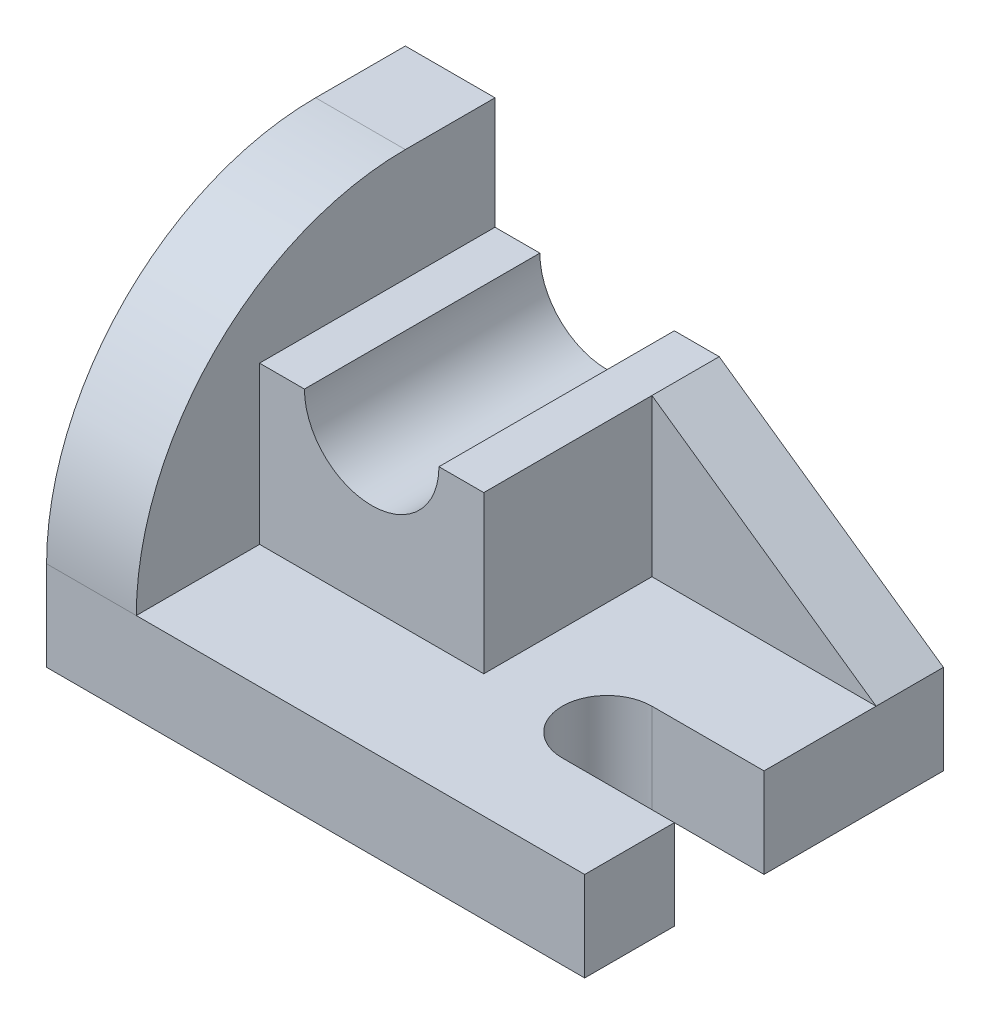
ISO-10303-21;
HEADER;
FILE_DESCRIPTION(('STEP AP214'),'2;1');
FILE_NAME('part.step','',(''),(''),'','','');
FILE_SCHEMA(('AUTOMOTIVE_DESIGN { 1 0 10303 214 1 1 1 1 }'));
ENDSEC;
DATA;
#1=APPLICATION_CONTEXT('core data for automotive mechanical design processes');
#2=APPLICATION_PROTOCOL_DEFINITION('international standard','automotive_design',2000,#1);
#3=PRODUCT_CONTEXT('',#1,'mechanical');
#4=PRODUCT('Part','Part','',(#3));
#5=PRODUCT_RELATED_PRODUCT_CATEGORY('part','',(#4));
#6=PRODUCT_DEFINITION_FORMATION('','',#4);
#7=PRODUCT_DEFINITION_CONTEXT('part definition',#1,'design');
#8=PRODUCT_DEFINITION('design','',#6,#7);
#9=PRODUCT_DEFINITION_SHAPE('','',#8);
#10=(LENGTH_UNIT() NAMED_UNIT(*) SI_UNIT(.MILLI.,.METRE.));
#11=(NAMED_UNIT(*) PLANE_ANGLE_UNIT() SI_UNIT($,.RADIAN.));
#12=(NAMED_UNIT(*) SI_UNIT($,.STERADIAN.) SOLID_ANGLE_UNIT());
#13=UNCERTAINTY_MEASURE_WITH_UNIT(LENGTH_MEASURE(1.E-05),#10,'distance_accuracy_value','');
#14=(GEOMETRIC_REPRESENTATION_CONTEXT(3) GLOBAL_UNCERTAINTY_ASSIGNED_CONTEXT((#13)) GLOBAL_UNIT_ASSIGNED_CONTEXT((#10,
#11,#12)) REPRESENTATION_CONTEXT('',''));
#15=CARTESIAN_POINT('',(0.,0.,0.));
#16=DIRECTION('',(0.,0.,1.));
#17=DIRECTION('',(1.,0.,0.));
#18=AXIS2_PLACEMENT_3D('',#15,#16,#17);
#19=CARTESIAN_POINT('',(60.,0.,64.));
#20=DIRECTION('',(1.,0.,0.));
#21=DIRECTION('',(0.,0.,-1.));
#22=AXIS2_PLACEMENT_3D('',#19,#20,#21);
#23=PLANE('',#22);
#24=DIRECTION('',(0.,1.,0.));
#25=VECTOR('',#24,1.);
#26=CARTESIAN_POINT('',(60.,-16.,32.));
#27=LINE('',#26,#25);
#28=CARTESIAN_POINT('',(60.,-16.,32.));
#29=VERTEX_POINT('',#28);
#30=CARTESIAN_POINT('',(60.,0.,32.));
#31=VERTEX_POINT('',#30);
#32=EDGE_CURVE('E192',#29,#31,#27,.T.);
#33=ORIENTED_EDGE('',*,*,#32,.F.);
#34=DIRECTION('',(0.,0.,-1.));
#35=VECTOR('',#34,1.);
#36=CARTESIAN_POINT('',(60.,-16.,64.));
#37=LINE('',#36,#35);
#38=CARTESIAN_POINT('',(60.,-16.,0.));
#39=VERTEX_POINT('',#38);
#40=EDGE_CURVE('E286',#29,#39,#37,.T.);
#41=ORIENTED_EDGE('',*,*,#40,.T.);
#42=DIRECTION('',(0.,-1.,0.));
#43=VECTOR('',#42,1.);
#44=CARTESIAN_POINT('',(60.,0.,0.));
#45=LINE('',#44,#43);
#46=CARTESIAN_POINT('',(60.,0.,0.));
#47=VERTEX_POINT('',#46);
#48=EDGE_CURVE('E260',#47,#39,#45,.T.);
#49=ORIENTED_EDGE('',*,*,#48,.F.);
#50=DIRECTION('',(0.,0.,-1.));
#51=VECTOR('',#50,1.);
#52=CARTESIAN_POINT('',(60.,0.,12.));
#53=LINE('',#52,#51);
#54=CARTESIAN_POINT('',(60.,0.,12.));
#55=VERTEX_POINT('',#54);
#56=EDGE_CURVE('E250',#55,#47,#53,.T.);
#57=ORIENTED_EDGE('',*,*,#56,.F.);
#58=DIRECTION('',(0.,0.,-1.));
#59=VECTOR('',#58,1.);
#60=CARTESIAN_POINT('',(60.,0.,64.));
#61=LINE('',#60,#59);
#62=EDGE_CURVE('E272',#31,#55,#61,.T.);
#63=ORIENTED_EDGE('',*,*,#62,.F.);
#64=EDGE_LOOP('',(#33,#41,#49,#57,#63));
#65=FACE_BOUND('',#64,.T.);
#66=ADVANCED_FACE('F43',(#65),#23,.T.);
#67=CARTESIAN_POINT('',(0.,28.,42.));
#68=DIRECTION('',(0.,-1.,0.));
#69=DIRECTION('',(1.,0.,0.));
#70=AXIS2_PLACEMENT_3D('',#67,#68,#69);
#71=PLANE('',#70);
#72=DIRECTION('',(-1.,0.,0.));
#73=VECTOR('',#72,1.);
#74=CARTESIAN_POINT('',(0.,28.,0.));
#75=LINE('',#74,#73);
#76=CARTESIAN_POINT('',(20.,28.,0.));
#77=VERTEX_POINT('',#76);
#78=CARTESIAN_POINT('',(12.,28.,0.));
#79=VERTEX_POINT('',#78);
#80=EDGE_CURVE('E293',#77,#79,#75,.T.);
#81=ORIENTED_EDGE('',*,*,#80,.T.);
#82=DIRECTION('',(0.,0.,-1.));
#83=VECTOR('',#82,1.);
#84=CARTESIAN_POINT('',(12.,28.,42.));
#85=LINE('',#84,#83);
#86=CARTESIAN_POINT('',(12.,28.,42.));
#87=VERTEX_POINT('',#86);
#88=EDGE_CURVE('E11',#87,#79,#85,.T.);
#89=ORIENTED_EDGE('',*,*,#88,.F.);
#90=DIRECTION('',(-1.,0.,0.));
#91=VECTOR('',#90,1.);
#92=CARTESIAN_POINT('',(0.,28.,42.));
#93=LINE('',#92,#91);
#94=CARTESIAN_POINT('',(20.,28.,42.));
#95=VERTEX_POINT('',#94);
#96=EDGE_CURVE('E294',#95,#87,#93,.T.);
#97=ORIENTED_EDGE('',*,*,#96,.F.);
#98=DIRECTION('',(0.,0.,-1.));
#99=VECTOR('',#98,1.);
#100=CARTESIAN_POINT('',(20.,28.,42.));
#101=LINE('',#100,#99);
#102=CARTESIAN_POINT('',(20.,28.,12.));
#103=VERTEX_POINT('',#102);
#104=EDGE_CURVE('E316',#95,#103,#101,.T.);
#105=ORIENTED_EDGE('',*,*,#104,.T.);
#106=DIRECTION('',(0.,0.,-1.));
#107=VECTOR('',#106,1.);
#108=CARTESIAN_POINT('',(20.,28.,12.));
#109=LINE('',#108,#107);
#110=EDGE_CURVE('E244',#103,#77,#109,.T.);
#111=ORIENTED_EDGE('',*,*,#110,.T.);
#112=EDGE_LOOP('',(#81,#89,#97,#105,#111));
#113=FACE_BOUND('',#112,.T.);
#114=ADVANCED_FACE('F45',(#113),#71,.F.);
#115=CARTESIAN_POINT('',(0.,28.,42.));
#116=DIRECTION('',(0.,0.,-1.));
#117=DIRECTION('',(-1.,0.,0.));
#118=AXIS2_PLACEMENT_3D('',#115,#116,#117);
#119=CYLINDRICAL_SURFACE('',#118,12.);
#120=CARTESIAN_POINT('',(0.,28.,0.));
#121=DIRECTION('',(0.,0.,1.));
#122=DIRECTION('',(1.,0.,0.));
#123=AXIS2_PLACEMENT_3D('',#120,#121,#122);
#124=CIRCLE('',#123,12.);
#125=CARTESIAN_POINT('',(-12.,28.,0.));
#126=VERTEX_POINT('',#125);
#127=EDGE_CURVE('E320',#79,#126,#124,.F.);
#128=ORIENTED_EDGE('',*,*,#127,.T.);
#129=DIRECTION('',(0.,0.,-1.));
#130=VECTOR('',#129,1.);
#131=CARTESIAN_POINT('',(-12.,28.,42.));
#132=LINE('',#131,#130);
#133=CARTESIAN_POINT('',(-12.,28.,42.));
#134=VERTEX_POINT('',#133);
#135=EDGE_CURVE('E52',#134,#126,#132,.T.);
#136=ORIENTED_EDGE('',*,*,#135,.F.);
#137=CARTESIAN_POINT('',(0.,28.,42.));
#138=DIRECTION('',(0.,0.,1.));
#139=DIRECTION('',(1.,0.,0.));
#140=AXIS2_PLACEMENT_3D('',#137,#138,#139);
#141=CIRCLE('',#140,12.);
#142=EDGE_CURVE('E298',#87,#134,#141,.F.);
#143=ORIENTED_EDGE('',*,*,#142,.F.);
#144=ORIENTED_EDGE('',*,*,#88,.T.);
#145=EDGE_LOOP('',(#128,#136,#143,#144));
#146=FACE_BOUND('',#145,.T.);
#147=ADVANCED_FACE('F356',(#146),#119,.F.);
#148=CARTESIAN_POINT('',(0.,28.,42.));
#149=DIRECTION('',(0.,-1.,0.));
#150=DIRECTION('',(1.,0.,0.));
#151=AXIS2_PLACEMENT_3D('',#148,#149,#150);
#152=PLANE('',#151);
#153=DIRECTION('',(-1.,0.,0.));
#154=VECTOR('',#153,1.);
#155=CARTESIAN_POINT('',(0.,28.,0.));
#156=LINE('',#155,#154);
#157=CARTESIAN_POINT('',(-20.,28.,0.));
#158=VERTEX_POINT('',#157);
#159=EDGE_CURVE('E299',#126,#158,#156,.T.);
#160=ORIENTED_EDGE('',*,*,#159,.T.);
#161=DIRECTION('',(0.,0.,-1.));
#162=VECTOR('',#161,1.);
#163=CARTESIAN_POINT('',(-20.,28.,42.));
#164=LINE('',#163,#162);
#165=CARTESIAN_POINT('',(-20.,28.,42.));
#166=VERTEX_POINT('',#165);
#167=EDGE_CURVE('E331',#166,#158,#164,.T.);
#168=ORIENTED_EDGE('',*,*,#167,.F.);
#169=DIRECTION('',(-1.,0.,0.));
#170=VECTOR('',#169,1.);
#171=CARTESIAN_POINT('',(0.,28.,42.));
#172=LINE('',#171,#170);
#173=EDGE_CURVE('E302',#134,#166,#172,.T.);
#174=ORIENTED_EDGE('',*,*,#173,.F.);
#175=ORIENTED_EDGE('',*,*,#135,.T.);
#176=EDGE_LOOP('',(#160,#168,#174,#175));
#177=FACE_BOUND('',#176,.T.);
#178=ADVANCED_FACE('F339',(#177),#152,.F.);
#179=CARTESIAN_POINT('',(20.,0.,42.));
#180=DIRECTION('',(-1.,0.,0.));
#181=DIRECTION('',(0.,-1.,0.));
#182=AXIS2_PLACEMENT_3D('',#179,#180,#181);
#183=PLANE('',#182);
#184=DIRECTION('',(0.,0.,-1.));
#185=VECTOR('',#184,1.);
#186=CARTESIAN_POINT('',(20.,0.,42.));
#187=LINE('',#186,#185);
#188=CARTESIAN_POINT('',(20.,0.,42.));
#189=VERTEX_POINT('',#188);
#190=CARTESIAN_POINT('',(20.,0.,12.));
#191=VERTEX_POINT('',#190);
#192=EDGE_CURVE('E328',#189,#191,#187,.T.);
#193=ORIENTED_EDGE('',*,*,#192,.T.);
#194=DIRECTION('',(0.,1.,0.));
#195=VECTOR('',#194,1.);
#196=CARTESIAN_POINT('',(20.,0.,12.));
#197=LINE('',#196,#195);
#198=EDGE_CURVE('E67',#191,#103,#197,.T.);
#199=ORIENTED_EDGE('',*,*,#198,.T.);
#200=ORIENTED_EDGE('',*,*,#104,.F.);
#201=DIRECTION('',(0.,1.,0.));
#202=VECTOR('',#201,1.);
#203=CARTESIAN_POINT('',(20.,0.,42.));
#204=LINE('',#203,#202);
#205=EDGE_CURVE('E313',#189,#95,#204,.T.);
#206=ORIENTED_EDGE('',*,*,#205,.F.);
#207=EDGE_LOOP('',(#193,#199,#200,#206));
#208=FACE_BOUND('',#207,.T.);
#209=ADVANCED_FACE('F424',(#208),#183,.F.);
#210=CARTESIAN_POINT('',(0.,0.,42.));
#211=DIRECTION('',(0.,0.,1.));
#212=DIRECTION('',(1.,0.,0.));
#213=AXIS2_PLACEMENT_3D('',#210,#211,#212);
#214=PLANE('',#213);
#215=ORIENTED_EDGE('',*,*,#96,.T.);
#216=ORIENTED_EDGE('',*,*,#142,.T.);
#217=ORIENTED_EDGE('',*,*,#173,.T.);
#218=DIRECTION('',(0.,-1.,0.));
#219=VECTOR('',#218,1.);
#220=CARTESIAN_POINT('',(-20.,0.,42.));
#221=LINE('',#220,#219);
#222=CARTESIAN_POINT('',(-20.,0.,42.));
#223=VERTEX_POINT('',#222);
#224=EDGE_CURVE('E306',#166,#223,#221,.T.);
#225=ORIENTED_EDGE('',*,*,#224,.T.);
#226=DIRECTION('',(1.,0.,0.));
#227=VECTOR('',#226,1.);
#228=CARTESIAN_POINT('',(0.,0.,42.));
#229=LINE('',#228,#227);
#230=EDGE_CURVE('E310',#223,#189,#229,.T.);
#231=ORIENTED_EDGE('',*,*,#230,.T.);
#232=ORIENTED_EDGE('',*,*,#205,.T.);
#233=EDGE_LOOP('',(#215,#216,#217,#225,#231,#232));
#234=FACE_BOUND('',#233,.T.);
#235=ADVANCED_FACE('F353',(#234),#214,.T.);
#236=CARTESIAN_POINT('',(0.,0.,0.));
#237=DIRECTION('',(0.,0.,1.));
#238=DIRECTION('',(1.,0.,0.));
#239=AXIS2_PLACEMENT_3D('',#236,#237,#238);
#240=PLANE('',#239);
#241=ORIENTED_EDGE('',*,*,#80,.F.);
#242=DIRECTION('',(-0.81923192051904,0.573462344363328,0.));
#243=VECTOR('',#242,1.);
#244=CARTESIAN_POINT('',(19.7315436241611,28.1879194630872,0.));
#245=LINE('',#244,#243);
#246=EDGE_CURVE('E233',#47,#77,#245,.T.);
#247=ORIENTED_EDGE('',*,*,#246,.F.);
#248=ORIENTED_EDGE('',*,*,#48,.T.);
#249=DIRECTION('',(-1.,0.,0.));
#250=VECTOR('',#249,1.);
#251=CARTESIAN_POINT('',(0.,-16.,0.));
#252=LINE('',#251,#250);
#253=CARTESIAN_POINT('',(-36.,-16.,0.));
#254=VERTEX_POINT('',#253);
#255=EDGE_CURVE('E275',#39,#254,#252,.T.);
#256=ORIENTED_EDGE('',*,*,#255,.T.);
#257=DIRECTION('',(0.,1.,0.));
#258=VECTOR('',#257,1.);
#259=CARTESIAN_POINT('',(-36.,0.,0.));
#260=LINE('',#259,#258);
#261=CARTESIAN_POINT('',(-36.,48.,0.));
#262=VERTEX_POINT('',#261);
#263=EDGE_CURVE('E254',#254,#262,#260,.T.);
#264=ORIENTED_EDGE('',*,*,#263,.T.);
#265=DIRECTION('',(1.,0.,0.));
#266=VECTOR('',#265,1.);
#267=CARTESIAN_POINT('',(0.,48.,0.));
#268=LINE('',#267,#266);
#269=CARTESIAN_POINT('',(-20.,48.,0.));
#270=VERTEX_POINT('',#269);
#271=EDGE_CURVE('E220',#262,#270,#268,.T.);
#272=ORIENTED_EDGE('',*,*,#271,.T.);
#273=DIRECTION('',(0.,-1.,0.));
#274=VECTOR('',#273,1.);
#275=CARTESIAN_POINT('',(-20.,0.,0.));
#276=LINE('',#275,#274);
#277=EDGE_CURVE('E208',#270,#158,#276,.T.);
#278=ORIENTED_EDGE('',*,*,#277,.T.);
#279=ORIENTED_EDGE('',*,*,#159,.F.);
#280=ORIENTED_EDGE('',*,*,#127,.F.);
#281=EDGE_LOOP('',(#241,#247,#248,#256,#264,#272,#278,#279,#280));
#282=FACE_BOUND('',#281,.T.);
#283=ADVANCED_FACE('F344',(#282),#240,.F.);
#284=CARTESIAN_POINT('',(0.,0.,64.));
#285=DIRECTION('',(0.,1.,0.));
#286=DIRECTION('',(0.,0.,1.));
#287=AXIS2_PLACEMENT_3D('',#284,#285,#286);
#288=PLANE('',#287);
#289=DIRECTION('',(-1.,0.,0.));
#290=VECTOR('',#289,1.);
#291=CARTESIAN_POINT('',(0.,0.,32.));
#292=LINE('',#291,#290);
#293=CARTESIAN_POINT('',(40.,0.,32.));
#294=VERTEX_POINT('',#293);
#295=EDGE_CURVE('E199',#31,#294,#292,.T.);
#296=ORIENTED_EDGE('',*,*,#295,.F.);
#297=ORIENTED_EDGE('',*,*,#62,.T.);
#298=DIRECTION('',(1.,0.,0.));
#299=VECTOR('',#298,1.);
#300=CARTESIAN_POINT('',(0.,0.,12.));
#301=LINE('',#300,#299);
#302=EDGE_CURVE('E234',#191,#55,#301,.T.);
#303=ORIENTED_EDGE('',*,*,#302,.F.);
#304=ORIENTED_EDGE('',*,*,#192,.F.);
#305=ORIENTED_EDGE('',*,*,#230,.F.);
#306=DIRECTION('',(0.,0.,-1.));
#307=VECTOR('',#306,1.);
#308=CARTESIAN_POINT('',(-20.,0.,64.));
#309=LINE('',#308,#307);
#310=CARTESIAN_POINT('',(-20.,0.,64.));
#311=VERTEX_POINT('',#310);
#312=EDGE_CURVE('E209',#311,#223,#309,.T.);
#313=ORIENTED_EDGE('',*,*,#312,.F.);
#314=DIRECTION('',(1.,0.,0.));
#315=VECTOR('',#314,1.);
#316=CARTESIAN_POINT('',(0.,0.,64.));
#317=LINE('',#316,#315);
#318=CARTESIAN_POINT('',(60.,0.,64.));
#319=VERTEX_POINT('',#318);
#320=EDGE_CURVE('E268',#311,#319,#317,.T.);
#321=ORIENTED_EDGE('',*,*,#320,.T.);
#322=CARTESIAN_POINT('',(60.,0.,48.));
#323=VERTEX_POINT('',#322);
#324=EDGE_CURVE('E282',#319,#323,#61,.T.);
#325=ORIENTED_EDGE('',*,*,#324,.T.);
#326=DIRECTION('',(1.,0.,0.));
#327=VECTOR('',#326,1.);
#328=CARTESIAN_POINT('',(0.,0.,48.));
#329=LINE('',#328,#327);
#330=CARTESIAN_POINT('',(40.,0.,48.));
#331=VERTEX_POINT('',#330);
#332=EDGE_CURVE('E59',#331,#323,#329,.T.);
#333=ORIENTED_EDGE('',*,*,#332,.F.);
#334=CARTESIAN_POINT('',(40.,0.,40.));
#335=DIRECTION('',(0.,1.,0.));
#336=DIRECTION('',(0.,0.,1.));
#337=AXIS2_PLACEMENT_3D('',#334,#335,#336);
#338=CIRCLE('',#337,8.);
#339=EDGE_CURVE('E170',#294,#331,#338,.T.);
#340=ORIENTED_EDGE('',*,*,#339,.F.);
#341=EDGE_LOOP('',(#296,#297,#303,#304,#305,#313,#321,#325,#333,#340));
#342=FACE_BOUND('',#341,.T.);
#343=ADVANCED_FACE('F383',(#342),#288,.T.);
#344=CARTESIAN_POINT('',(-36.,0.,64.));
#345=DIRECTION('',(-1.,0.,0.));
#346=DIRECTION('',(0.,0.,1.));
#347=AXIS2_PLACEMENT_3D('',#344,#345,#346);
#348=PLANE('',#347);
#349=ORIENTED_EDGE('',*,*,#263,.F.);
#350=DIRECTION('',(0.,0.,-1.));
#351=VECTOR('',#350,1.);
#352=CARTESIAN_POINT('',(-36.,-16.,64.));
#353=LINE('',#352,#351);
#354=CARTESIAN_POINT('',(-36.,-16.,64.));
#355=VERTEX_POINT('',#354);
#356=EDGE_CURVE('E290',#355,#254,#353,.T.);
#357=ORIENTED_EDGE('',*,*,#356,.F.);
#358=DIRECTION('',(0.,1.,0.));
#359=VECTOR('',#358,1.);
#360=CARTESIAN_POINT('',(-36.,0.,64.));
#361=LINE('',#360,#359);
#362=CARTESIAN_POINT('',(-36.,0.,64.));
#363=VERTEX_POINT('',#362);
#364=EDGE_CURVE('E255',#355,#363,#361,.T.);
#365=ORIENTED_EDGE('',*,*,#364,.T.);
#366=CARTESIAN_POINT('',(-36.,0.,16.));
#367=DIRECTION('',(1.,0.,0.));
#368=DIRECTION('',(0.,0.,-1.));
#369=AXIS2_PLACEMENT_3D('',#366,#367,#368);
#370=CIRCLE('',#369,48.);
#371=CARTESIAN_POINT('',(-36.,48.,16.));
#372=VERTEX_POINT('',#371);
#373=EDGE_CURVE('E205',#372,#363,#370,.T.);
#374=ORIENTED_EDGE('',*,*,#373,.F.);
#375=DIRECTION('',(0.,0.,-1.));
#376=VECTOR('',#375,1.);
#377=CARTESIAN_POINT('',(-36.,48.,16.));
#378=LINE('',#377,#376);
#379=EDGE_CURVE('E219',#372,#262,#378,.T.);
#380=ORIENTED_EDGE('',*,*,#379,.T.);
#381=EDGE_LOOP('',(#349,#357,#365,#374,#380));
#382=FACE_BOUND('',#381,.T.);
#383=ADVANCED_FACE('F372',(#382),#348,.T.);
#384=CARTESIAN_POINT('',(0.,-16.,64.));
#385=DIRECTION('',(0.,-1.,0.));
#386=DIRECTION('',(1.,0.,0.));
#387=AXIS2_PLACEMENT_3D('',#384,#385,#386);
#388=PLANE('',#387);
#389=DIRECTION('',(-1.,0.,0.));
#390=VECTOR('',#389,1.);
#391=CARTESIAN_POINT('',(0.,-16.,32.));
#392=LINE('',#391,#390);
#393=CARTESIAN_POINT('',(40.,-16.,32.));
#394=VERTEX_POINT('',#393);
#395=EDGE_CURVE('E173',#29,#394,#392,.T.);
#396=ORIENTED_EDGE('',*,*,#395,.T.);
#397=CARTESIAN_POINT('',(40.,-16.,40.));
#398=DIRECTION('',(0.,1.,0.));
#399=DIRECTION('',(0.,0.,1.));
#400=AXIS2_PLACEMENT_3D('',#397,#398,#399);
#401=CIRCLE('',#400,8.);
#402=CARTESIAN_POINT('',(40.,-16.,48.));
#403=VERTEX_POINT('',#402);
#404=EDGE_CURVE('E167',#394,#403,#401,.T.);
#405=ORIENTED_EDGE('',*,*,#404,.T.);
#406=DIRECTION('',(1.,0.,0.));
#407=VECTOR('',#406,1.);
#408=CARTESIAN_POINT('',(0.,-16.,48.));
#409=LINE('',#408,#407);
#410=CARTESIAN_POINT('',(60.,-16.,48.));
#411=VERTEX_POINT('',#410);
#412=EDGE_CURVE('E176',#403,#411,#409,.T.);
#413=ORIENTED_EDGE('',*,*,#412,.T.);
#414=CARTESIAN_POINT('',(60.,-16.,64.));
#415=VERTEX_POINT('',#414);
#416=EDGE_CURVE('E287',#415,#411,#37,.T.);
#417=ORIENTED_EDGE('',*,*,#416,.F.);
#418=DIRECTION('',(-1.,0.,0.));
#419=VECTOR('',#418,1.);
#420=CARTESIAN_POINT('',(0.,-16.,64.));
#421=LINE('',#420,#419);
#422=EDGE_CURVE('E259',#415,#355,#421,.T.);
#423=ORIENTED_EDGE('',*,*,#422,.T.);
#424=ORIENTED_EDGE('',*,*,#356,.T.);
#425=ORIENTED_EDGE('',*,*,#255,.F.);
#426=ORIENTED_EDGE('',*,*,#40,.F.);
#427=EDGE_LOOP('',(#396,#405,#413,#417,#423,#424,#425,#426));
#428=FACE_BOUND('',#427,.T.);
#429=ADVANCED_FACE('F182',(#428),#388,.T.);
#430=DIRECTION('',(0.,1.,0.));
#431=VECTOR('',#430,1.);
#432=CARTESIAN_POINT('',(60.,-16.,48.));
#433=LINE('',#432,#431);
#434=EDGE_CURVE('E172',#411,#323,#433,.T.);
#435=ORIENTED_EDGE('',*,*,#434,.T.);
#436=ORIENTED_EDGE('',*,*,#324,.F.);
#437=DIRECTION('',(0.,-1.,0.));
#438=VECTOR('',#437,1.);
#439=CARTESIAN_POINT('',(60.,0.,64.));
#440=LINE('',#439,#438);
#441=EDGE_CURVE('E264',#319,#415,#440,.T.);
#442=ORIENTED_EDGE('',*,*,#441,.T.);
#443=ORIENTED_EDGE('',*,*,#416,.T.);
#444=EDGE_LOOP('',(#435,#436,#442,#443));
#445=FACE_BOUND('',#444,.T.);
#446=ADVANCED_FACE('F404',(#445),#23,.T.);
#447=CARTESIAN_POINT('',(0.,0.,64.));
#448=DIRECTION('',(0.,0.,1.));
#449=DIRECTION('',(1.,0.,0.));
#450=AXIS2_PLACEMENT_3D('',#447,#448,#449);
#451=PLANE('',#450);
#452=ORIENTED_EDGE('',*,*,#364,.F.);
#453=ORIENTED_EDGE('',*,*,#422,.F.);
#454=ORIENTED_EDGE('',*,*,#441,.F.);
#455=ORIENTED_EDGE('',*,*,#320,.F.);
#456=EDGE_CURVE('E269',#363,#311,#317,.T.);
#457=ORIENTED_EDGE('',*,*,#456,.F.);
#458=EDGE_LOOP('',(#452,#453,#454,#455,#457));
#459=FACE_BOUND('',#458,.T.);
#460=ADVANCED_FACE('F388',(#459),#451,.T.);
#461=CARTESIAN_POINT('',(19.7315436241611,28.1879194630872,12.));
#462=DIRECTION('',(-0.573462344363328,-0.81923192051904,0.));
#463=DIRECTION('',(0.81923192051904,-0.573462344363328,0.));
#464=AXIS2_PLACEMENT_3D('',#461,#462,#463);
#465=PLANE('',#464);
#466=ORIENTED_EDGE('',*,*,#246,.T.);
#467=ORIENTED_EDGE('',*,*,#110,.F.);
#468=DIRECTION('',(-0.81923192051904,0.573462344363328,0.));
#469=VECTOR('',#468,1.);
#470=CARTESIAN_POINT('',(19.7315436241611,28.1879194630872,12.));
#471=LINE('',#470,#469);
#472=EDGE_CURVE('E238',#55,#103,#471,.T.);
#473=ORIENTED_EDGE('',*,*,#472,.F.);
#474=ORIENTED_EDGE('',*,*,#56,.T.);
#475=EDGE_LOOP('',(#466,#467,#473,#474));
#476=FACE_BOUND('',#475,.T.);
#477=ADVANCED_FACE('F361',(#476),#465,.F.);
#478=CARTESIAN_POINT('',(0.,0.,12.));
#479=DIRECTION('',(0.,0.,1.));
#480=DIRECTION('',(1.,0.,0.));
#481=AXIS2_PLACEMENT_3D('',#478,#479,#480);
#482=PLANE('',#481);
#483=ORIENTED_EDGE('',*,*,#302,.T.);
#484=ORIENTED_EDGE('',*,*,#472,.T.);
#485=ORIENTED_EDGE('',*,*,#198,.F.);
#486=EDGE_LOOP('',(#483,#484,#485));
#487=FACE_BOUND('',#486,.T.);
#488=ADVANCED_FACE('F483',(#487),#482,.T.);
#489=CARTESIAN_POINT('',(-20.,0.,16.));
#490=DIRECTION('',(1.,0.,0.));
#491=DIRECTION('',(0.,1.,0.));
#492=AXIS2_PLACEMENT_3D('',#489,#490,#491);
#493=PLANE('',#492);
#494=ORIENTED_EDGE('',*,*,#167,.T.);
#495=ORIENTED_EDGE('',*,*,#277,.F.);
#496=DIRECTION('',(0.,0.,-1.));
#497=VECTOR('',#496,1.);
#498=CARTESIAN_POINT('',(-20.,48.,16.));
#499=LINE('',#498,#497);
#500=CARTESIAN_POINT('',(-20.,48.,16.));
#501=VERTEX_POINT('',#500);
#502=EDGE_CURVE('E230',#501,#270,#499,.T.);
#503=ORIENTED_EDGE('',*,*,#502,.F.);
#504=CARTESIAN_POINT('',(-20.,0.,16.));
#505=DIRECTION('',(1.,0.,0.));
#506=DIRECTION('',(0.,0.,-1.));
#507=AXIS2_PLACEMENT_3D('',#504,#505,#506);
#508=CIRCLE('',#507,48.);
#509=EDGE_CURVE('E204',#501,#311,#508,.T.);
#510=ORIENTED_EDGE('',*,*,#509,.T.);
#511=ORIENTED_EDGE('',*,*,#312,.T.);
#512=ORIENTED_EDGE('',*,*,#224,.F.);
#513=EDGE_LOOP('',(#494,#495,#503,#510,#511,#512));
#514=FACE_BOUND('',#513,.T.);
#515=ADVANCED_FACE('F349',(#514),#493,.T.);
#516=CARTESIAN_POINT('',(0.,48.,16.));
#517=DIRECTION('',(0.,1.,0.));
#518=DIRECTION('',(0.,0.,1.));
#519=AXIS2_PLACEMENT_3D('',#516,#517,#518);
#520=PLANE('',#519);
#521=ORIENTED_EDGE('',*,*,#271,.F.);
#522=ORIENTED_EDGE('',*,*,#379,.F.);
#523=DIRECTION('',(1.,0.,0.));
#524=VECTOR('',#523,1.);
#525=CARTESIAN_POINT('',(0.,48.,16.));
#526=LINE('',#525,#524);
#527=EDGE_CURVE('E215',#372,#501,#526,.T.);
#528=ORIENTED_EDGE('',*,*,#527,.T.);
#529=ORIENTED_EDGE('',*,*,#502,.T.);
#530=EDGE_LOOP('',(#521,#522,#528,#529));
#531=FACE_BOUND('',#530,.T.);
#532=ADVANCED_FACE('F376',(#531),#520,.T.);
#533=CARTESIAN_POINT('',(-36.,0.,16.));
#534=DIRECTION('',(1.,0.,0.));
#535=DIRECTION('',(0.,0.,-1.));
#536=AXIS2_PLACEMENT_3D('',#533,#534,#535);
#537=CYLINDRICAL_SURFACE('',#536,48.);
#538=ORIENTED_EDGE('',*,*,#509,.F.);
#539=ORIENTED_EDGE('',*,*,#527,.F.);
#540=ORIENTED_EDGE('',*,*,#373,.T.);
#541=ORIENTED_EDGE('',*,*,#456,.T.);
#542=EDGE_LOOP('',(#538,#539,#540,#541));
#543=FACE_BOUND('',#542,.T.);
#544=ADVANCED_FACE('F378',(#543),#537,.T.);
#545=CARTESIAN_POINT('',(40.,-16.,40.));
#546=DIRECTION('',(0.,1.,0.));
#547=DIRECTION('',(0.,0.,1.));
#548=AXIS2_PLACEMENT_3D('',#545,#546,#547);
#549=CYLINDRICAL_SURFACE('',#548,8.);
#550=ORIENTED_EDGE('',*,*,#339,.T.);
#551=DIRECTION('',(0.,1.,0.));
#552=VECTOR('',#551,1.);
#553=CARTESIAN_POINT('',(40.,-16.,48.));
#554=LINE('',#553,#552);
#555=EDGE_CURVE('E162',#403,#331,#554,.T.);
#556=ORIENTED_EDGE('',*,*,#555,.F.);
#557=ORIENTED_EDGE('',*,*,#404,.F.);
#558=DIRECTION('',(0.,1.,0.));
#559=VECTOR('',#558,1.);
#560=CARTESIAN_POINT('',(40.,-16.,32.));
#561=LINE('',#560,#559);
#562=EDGE_CURVE('E189',#394,#294,#561,.T.);
#563=ORIENTED_EDGE('',*,*,#562,.T.);
#564=EDGE_LOOP('',(#550,#556,#557,#563));
#565=FACE_BOUND('',#564,.T.);
#566=ADVANCED_FACE('F164',(#565),#549,.F.);
#567=CARTESIAN_POINT('',(0.,-16.,32.));
#568=DIRECTION('',(0.,0.,-1.));
#569=DIRECTION('',(-1.,0.,0.));
#570=AXIS2_PLACEMENT_3D('',#567,#568,#569);
#571=PLANE('',#570);
#572=ORIENTED_EDGE('',*,*,#295,.T.);
#573=ORIENTED_EDGE('',*,*,#562,.F.);
#574=ORIENTED_EDGE('',*,*,#395,.F.);
#575=ORIENTED_EDGE('',*,*,#32,.T.);
#576=EDGE_LOOP('',(#572,#573,#574,#575));
#577=FACE_BOUND('',#576,.T.);
#578=ADVANCED_FACE('F393',(#577),#571,.F.);
#579=CARTESIAN_POINT('',(0.,-16.,48.));
#580=DIRECTION('',(0.,0.,1.));
#581=DIRECTION('',(1.,0.,0.));
#582=AXIS2_PLACEMENT_3D('',#579,#580,#581);
#583=PLANE('',#582);
#584=ORIENTED_EDGE('',*,*,#332,.T.);
#585=ORIENTED_EDGE('',*,*,#434,.F.);
#586=ORIENTED_EDGE('',*,*,#412,.F.);
#587=ORIENTED_EDGE('',*,*,#555,.T.);
#588=EDGE_LOOP('',(#584,#585,#586,#587));
#589=FACE_BOUND('',#588,.T.);
#590=ADVANCED_FACE('F177',(#589),#583,.F.);
#591=CLOSED_SHELL('',(#66,#114,#147,#178,#209,#235,#283,#343,#383,#429,#446,#460,#477,#488,#515,
#532,#544,#566,#578,#590));
#592=MANIFOLD_SOLID_BREP('B2',#591);
#593=ADVANCED_BREP_SHAPE_REPRESENTATION('',(#18,#592),#14);
#594=SHAPE_DEFINITION_REPRESENTATION(#9,#593);
ENDSEC;
END-ISO-10303-21;
